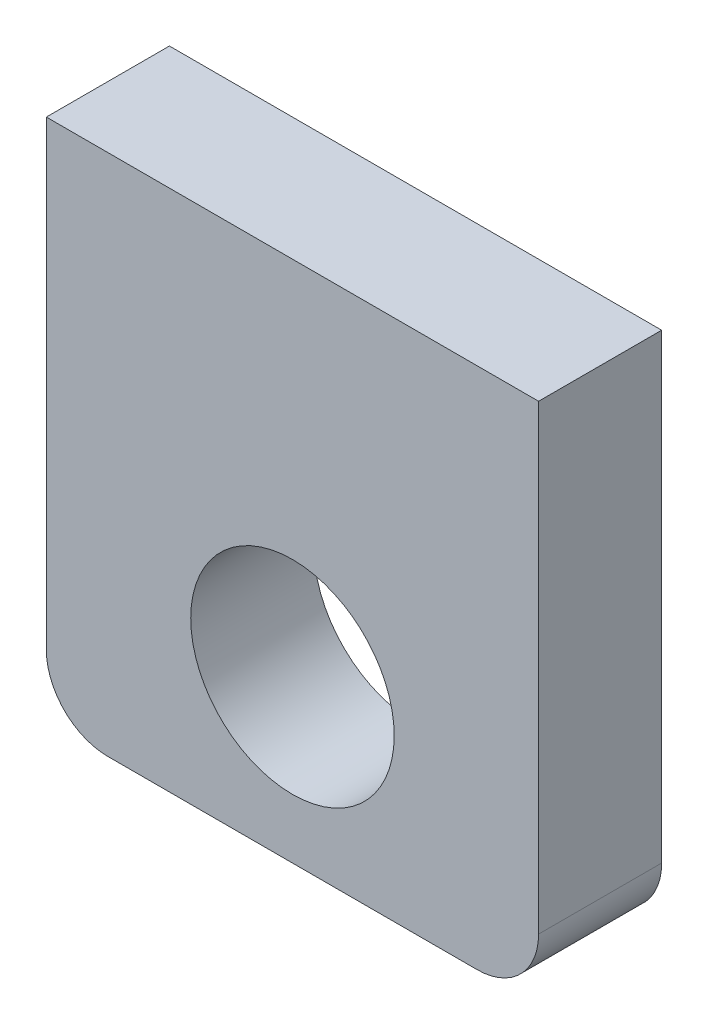
ISO-10303-21;
HEADER;
FILE_DESCRIPTION(('STEP AP214'),'2;1');
FILE_NAME('part.step','',(''),(''),'','','');
FILE_SCHEMA(('AUTOMOTIVE_DESIGN { 1 0 10303 214 1 1 1 1 }'));
ENDSEC;
DATA;
#1=APPLICATION_CONTEXT('core data for automotive mechanical design processes');
#2=APPLICATION_PROTOCOL_DEFINITION('international standard','automotive_design',2000,#1);
#3=PRODUCT_CONTEXT('',#1,'mechanical');
#4=PRODUCT('Part','Part','',(#3));
#5=PRODUCT_RELATED_PRODUCT_CATEGORY('part','',(#4));
#6=PRODUCT_DEFINITION_FORMATION('','',#4);
#7=PRODUCT_DEFINITION_CONTEXT('part definition',#1,'design');
#8=PRODUCT_DEFINITION('design','',#6,#7);
#9=PRODUCT_DEFINITION_SHAPE('','',#8);
#10=(LENGTH_UNIT() NAMED_UNIT(*) SI_UNIT(.MILLI.,.METRE.));
#11=(NAMED_UNIT(*) PLANE_ANGLE_UNIT() SI_UNIT($,.RADIAN.));
#12=(NAMED_UNIT(*) SI_UNIT($,.STERADIAN.) SOLID_ANGLE_UNIT());
#13=UNCERTAINTY_MEASURE_WITH_UNIT(LENGTH_MEASURE(1.E-05),#10,'distance_accuracy_value','');
#14=(GEOMETRIC_REPRESENTATION_CONTEXT(3) GLOBAL_UNCERTAINTY_ASSIGNED_CONTEXT((#13)) GLOBAL_UNIT_ASSIGNED_CONTEXT((#10,
#11,#12)) REPRESENTATION_CONTEXT('',''));
#15=CARTESIAN_POINT('',(0.,0.,0.));
#16=DIRECTION('',(0.,0.,1.));
#17=DIRECTION('',(1.,0.,0.));
#18=AXIS2_PLACEMENT_3D('',#15,#16,#17);
#19=CARTESIAN_POINT('',(25.4,-26.9875,6.35));
#20=DIRECTION('',(-1.,0.,0.));
#21=DIRECTION('',(0.,0.,1.));
#22=AXIS2_PLACEMENT_3D('',#19,#20,#21);
#23=PLANE('',#22);
#24=DIRECTION('',(0.,1.,0.));
#25=VECTOR('',#24,1.);
#26=CARTESIAN_POINT('',(25.4,-26.9875,6.35));
#27=LINE('',#26,#25);
#28=CARTESIAN_POINT('',(25.4,-20.6375,6.35));
#29=VERTEX_POINT('',#28);
#30=CARTESIAN_POINT('',(25.4,26.9875,6.35));
#31=VERTEX_POINT('',#30);
#32=EDGE_CURVE('E90',#29,#31,#27,.T.);
#33=ORIENTED_EDGE('',*,*,#32,.F.);
#34=DIRECTION('',(0.,0.,-1.));
#35=VECTOR('',#34,1.);
#36=CARTESIAN_POINT('',(25.4,-20.6375,6.35));
#37=LINE('',#36,#35);
#38=CARTESIAN_POINT('',(25.4,-20.6375,-6.35));
#39=VERTEX_POINT('',#38);
#40=EDGE_CURVE('E113',#29,#39,#37,.T.);
#41=ORIENTED_EDGE('',*,*,#40,.T.);
#42=DIRECTION('',(0.,1.,0.));
#43=VECTOR('',#42,1.);
#44=CARTESIAN_POINT('',(25.4,-26.9875,-6.35));
#45=LINE('',#44,#43);
#46=CARTESIAN_POINT('',(25.4,26.9875,-6.35));
#47=VERTEX_POINT('',#46);
#48=EDGE_CURVE('E111',#39,#47,#45,.T.);
#49=ORIENTED_EDGE('',*,*,#48,.T.);
#50=DIRECTION('',(0.,0.,-1.));
#51=VECTOR('',#50,1.);
#52=CARTESIAN_POINT('',(25.4,26.9875,6.35));
#53=LINE('',#52,#51);
#54=EDGE_CURVE('E105',#31,#47,#53,.T.);
#55=ORIENTED_EDGE('',*,*,#54,.F.);
#56=EDGE_LOOP('',(#33,#41,#49,#55));
#57=FACE_BOUND('',#56,.T.);
#58=ADVANCED_FACE('F36',(#57),#23,.F.);
#59=CARTESIAN_POINT('',(-25.4,26.9875,6.35));
#60=DIRECTION('',(0.,-1.,0.));
#61=DIRECTION('',(0.,0.,-1.));
#62=AXIS2_PLACEMENT_3D('',#59,#60,#61);
#63=PLANE('',#62);
#64=DIRECTION('',(-1.,0.,0.));
#65=VECTOR('',#64,1.);
#66=CARTESIAN_POINT('',(-25.4,26.9875,-6.35));
#67=LINE('',#66,#65);
#68=CARTESIAN_POINT('',(-25.4,26.9875,-6.35));
#69=VERTEX_POINT('',#68);
#70=EDGE_CURVE('E140',#47,#69,#67,.T.);
#71=ORIENTED_EDGE('',*,*,#70,.T.);
#72=DIRECTION('',(0.,0.,-1.));
#73=VECTOR('',#72,1.);
#74=CARTESIAN_POINT('',(-25.4,26.9875,6.35));
#75=LINE('',#74,#73);
#76=CARTESIAN_POINT('',(-25.4,26.9875,6.35));
#77=VERTEX_POINT('',#76);
#78=EDGE_CURVE('E107',#77,#69,#75,.T.);
#79=ORIENTED_EDGE('',*,*,#78,.F.);
#80=DIRECTION('',(-1.,0.,0.));
#81=VECTOR('',#80,1.);
#82=CARTESIAN_POINT('',(-25.4,26.9875,6.35));
#83=LINE('',#82,#81);
#84=EDGE_CURVE('E93',#31,#77,#83,.T.);
#85=ORIENTED_EDGE('',*,*,#84,.F.);
#86=ORIENTED_EDGE('',*,*,#54,.T.);
#87=EDGE_LOOP('',(#71,#79,#85,#86));
#88=FACE_BOUND('',#87,.T.);
#89=ADVANCED_FACE('F104',(#88),#63,.F.);
#90=CARTESIAN_POINT('',(-25.4,-26.9875,6.35));
#91=DIRECTION('',(1.,0.,0.));
#92=DIRECTION('',(0.,0.,-1.));
#93=AXIS2_PLACEMENT_3D('',#90,#91,#92);
#94=PLANE('',#93);
#95=DIRECTION('',(0.,-1.,0.));
#96=VECTOR('',#95,1.);
#97=CARTESIAN_POINT('',(-25.4,-26.9875,-6.35));
#98=LINE('',#97,#96);
#99=CARTESIAN_POINT('',(-25.4,-20.6375,-6.35));
#100=VERTEX_POINT('',#99);
#101=EDGE_CURVE('E138',#69,#100,#98,.T.);
#102=ORIENTED_EDGE('',*,*,#101,.T.);
#103=DIRECTION('',(0.,0.,-1.));
#104=VECTOR('',#103,1.);
#105=CARTESIAN_POINT('',(-25.4,-20.6375,6.35));
#106=LINE('',#105,#104);
#107=CARTESIAN_POINT('',(-25.4,-20.6375,6.35));
#108=VERTEX_POINT('',#107);
#109=EDGE_CURVE('E11',#100,#108,#106,.F.);
#110=ORIENTED_EDGE('',*,*,#109,.T.);
#111=DIRECTION('',(0.,-1.,0.));
#112=VECTOR('',#111,1.);
#113=CARTESIAN_POINT('',(-25.4,-26.9875,6.35));
#114=LINE('',#113,#112);
#115=EDGE_CURVE('E108',#77,#108,#114,.T.);
#116=ORIENTED_EDGE('',*,*,#115,.F.);
#117=ORIENTED_EDGE('',*,*,#78,.T.);
#118=EDGE_LOOP('',(#102,#110,#116,#117));
#119=FACE_BOUND('',#118,.T.);
#120=ADVANCED_FACE('F139',(#119),#94,.F.);
#121=CARTESIAN_POINT('',(-25.4,-26.9875,6.35));
#122=DIRECTION('',(0.,1.,0.));
#123=DIRECTION('',(0.,0.,1.));
#124=AXIS2_PLACEMENT_3D('',#121,#122,#123);
#125=PLANE('',#124);
#126=DIRECTION('',(1.,0.,0.));
#127=VECTOR('',#126,1.);
#128=CARTESIAN_POINT('',(-25.4,-26.9875,-6.35));
#129=LINE('',#128,#127);
#130=CARTESIAN_POINT('',(-19.05,-26.9875,-6.35));
#131=VERTEX_POINT('',#130);
#132=CARTESIAN_POINT('',(19.05,-26.9875,-6.35));
#133=VERTEX_POINT('',#132);
#134=EDGE_CURVE('E100',#131,#133,#129,.T.);
#135=ORIENTED_EDGE('',*,*,#134,.T.);
#136=DIRECTION('',(0.,0.,-1.));
#137=VECTOR('',#136,1.);
#138=CARTESIAN_POINT('',(19.05,-26.9875,6.35));
#139=LINE('',#138,#137);
#140=CARTESIAN_POINT('',(19.05,-26.9875,6.35));
#141=VERTEX_POINT('',#140);
#142=EDGE_CURVE('E57',#133,#141,#139,.F.);
#143=ORIENTED_EDGE('',*,*,#142,.T.);
#144=DIRECTION('',(1.,0.,0.));
#145=VECTOR('',#144,1.);
#146=CARTESIAN_POINT('',(-25.4,-26.9875,6.35));
#147=LINE('',#146,#145);
#148=CARTESIAN_POINT('',(-19.05,-26.9875,6.35));
#149=VERTEX_POINT('',#148);
#150=EDGE_CURVE('E117',#149,#141,#147,.T.);
#151=ORIENTED_EDGE('',*,*,#150,.F.);
#152=DIRECTION('',(0.,0.,-1.));
#153=VECTOR('',#152,1.);
#154=CARTESIAN_POINT('',(-19.05,-26.9875,6.35));
#155=LINE('',#154,#153);
#156=EDGE_CURVE('E124',#149,#131,#155,.T.);
#157=ORIENTED_EDGE('',*,*,#156,.T.);
#158=EDGE_LOOP('',(#135,#143,#151,#157));
#159=FACE_BOUND('',#158,.T.);
#160=ADVANCED_FACE('F132',(#159),#125,.F.);
#161=CARTESIAN_POINT('',(0.,0.,6.35));
#162=DIRECTION('',(0.,0.,-1.));
#163=DIRECTION('',(-1.,0.,0.));
#164=AXIS2_PLACEMENT_3D('',#161,#162,#163);
#165=PLANE('',#164);
#166=CARTESIAN_POINT('',(0.,-10.3505,6.35));
#167=DIRECTION('',(0.,0.,-1.));
#168=DIRECTION('',(-1.,0.,0.));
#169=AXIS2_PLACEMENT_3D('',#166,#167,#168);
#170=CIRCLE('',#169,10.499999971);
#171=CARTESIAN_POINT('',(-10.499999971,-10.3505,6.35));
#172=VERTEX_POINT('',#171);
#173=EDGE_CURVE('E144',#172,#172,#170,.T.);
#174=ORIENTED_EDGE('',*,*,#173,.T.);
#175=EDGE_LOOP('',(#174));
#176=FACE_BOUND('',#175,.T.);
#177=ORIENTED_EDGE('',*,*,#150,.T.);
#178=CARTESIAN_POINT('',(19.05,-20.6375,6.35));
#179=DIRECTION('',(0.,0.,-1.));
#180=DIRECTION('',(-1.,0.,0.));
#181=AXIS2_PLACEMENT_3D('',#178,#179,#180);
#182=CIRCLE('',#181,6.35);
#183=EDGE_CURVE('E44',#141,#29,#182,.F.);
#184=ORIENTED_EDGE('',*,*,#183,.T.);
#185=ORIENTED_EDGE('',*,*,#32,.T.);
#186=ORIENTED_EDGE('',*,*,#84,.T.);
#187=ORIENTED_EDGE('',*,*,#115,.T.);
#188=CARTESIAN_POINT('',(-19.05,-20.6375,6.35));
#189=DIRECTION('',(0.,0.,-1.));
#190=DIRECTION('',(-1.,0.,0.));
#191=AXIS2_PLACEMENT_3D('',#188,#189,#190);
#192=CIRCLE('',#191,6.35);
#193=EDGE_CURVE('E128',#108,#149,#192,.F.);
#194=ORIENTED_EDGE('',*,*,#193,.T.);
#195=EDGE_LOOP('',(#177,#184,#185,#186,#187,#194));
#196=FACE_BOUND('',#195,.T.);
#197=ADVANCED_FACE('F92',(#176,#196),#165,.F.);
#198=CARTESIAN_POINT('',(0.,0.,-6.35));
#199=DIRECTION('',(0.,0.,-1.));
#200=DIRECTION('',(-1.,0.,0.));
#201=AXIS2_PLACEMENT_3D('',#198,#199,#200);
#202=PLANE('',#201);
#203=CARTESIAN_POINT('',(0.,-10.3505,-6.35));
#204=DIRECTION('',(0.,0.,1.));
#205=DIRECTION('',(1.,0.,0.));
#206=AXIS2_PLACEMENT_3D('',#203,#204,#205);
#207=CIRCLE('',#206,10.499999971);
#208=CARTESIAN_POINT('',(10.499999971,-10.3505,-6.35));
#209=VERTEX_POINT('',#208);
#210=EDGE_CURVE('E149',#209,#209,#207,.T.);
#211=ORIENTED_EDGE('',*,*,#210,.T.);
#212=EDGE_LOOP('',(#211));
#213=FACE_BOUND('',#212,.T.);
#214=ORIENTED_EDGE('',*,*,#48,.F.);
#215=CARTESIAN_POINT('',(19.05,-20.6375,-6.35));
#216=DIRECTION('',(0.,0.,-1.));
#217=DIRECTION('',(-1.,0.,0.));
#218=AXIS2_PLACEMENT_3D('',#215,#216,#217);
#219=CIRCLE('',#218,6.35);
#220=EDGE_CURVE('E122',#39,#133,#219,.T.);
#221=ORIENTED_EDGE('',*,*,#220,.T.);
#222=ORIENTED_EDGE('',*,*,#134,.F.);
#223=CARTESIAN_POINT('',(-19.05,-20.6375,-6.35));
#224=DIRECTION('',(0.,0.,-1.));
#225=DIRECTION('',(-1.,0.,0.));
#226=AXIS2_PLACEMENT_3D('',#223,#224,#225);
#227=CIRCLE('',#226,6.35);
#228=EDGE_CURVE('E115',#131,#100,#227,.T.);
#229=ORIENTED_EDGE('',*,*,#228,.T.);
#230=ORIENTED_EDGE('',*,*,#101,.F.);
#231=ORIENTED_EDGE('',*,*,#70,.F.);
#232=EDGE_LOOP('',(#214,#221,#222,#229,#230,#231));
#233=FACE_BOUND('',#232,.T.);
#234=ADVANCED_FACE('F137',(#213,#233),#202,.T.);
#235=CARTESIAN_POINT('',(0.,-10.3505,-6.35));
#236=DIRECTION('',(0.,0.,1.));
#237=DIRECTION('',(1.,0.,0.));
#238=AXIS2_PLACEMENT_3D('',#235,#236,#237);
#239=CYLINDRICAL_SURFACE('',#238,10.499999971);
#240=ORIENTED_EDGE('',*,*,#210,.F.);
#241=EDGE_LOOP('',(#240));
#242=FACE_BOUND('',#241,.T.);
#243=ORIENTED_EDGE('',*,*,#173,.F.);
#244=EDGE_LOOP('',(#243));
#245=FACE_BOUND('',#244,.T.);
#246=ADVANCED_FACE('F154',(#242,#245),#239,.F.);
#247=CARTESIAN_POINT('',(19.05,-20.6375,6.35));
#248=DIRECTION('',(0.,0.,-1.));
#249=DIRECTION('',(-1.,0.,0.));
#250=AXIS2_PLACEMENT_3D('',#247,#248,#249);
#251=CYLINDRICAL_SURFACE('',#250,6.35);
#252=ORIENTED_EDGE('',*,*,#183,.F.);
#253=ORIENTED_EDGE('',*,*,#142,.F.);
#254=ORIENTED_EDGE('',*,*,#220,.F.);
#255=ORIENTED_EDGE('',*,*,#40,.F.);
#256=EDGE_LOOP('',(#252,#253,#254,#255));
#257=FACE_BOUND('',#256,.T.);
#258=ADVANCED_FACE('F157',(#257),#251,.T.);
#259=CARTESIAN_POINT('',(-19.05,-20.6375,6.35));
#260=DIRECTION('',(0.,0.,-1.));
#261=DIRECTION('',(-1.,0.,0.));
#262=AXIS2_PLACEMENT_3D('',#259,#260,#261);
#263=CYLINDRICAL_SURFACE('',#262,6.35);
#264=ORIENTED_EDGE('',*,*,#193,.F.);
#265=ORIENTED_EDGE('',*,*,#109,.F.);
#266=ORIENTED_EDGE('',*,*,#228,.F.);
#267=ORIENTED_EDGE('',*,*,#156,.F.);
#268=EDGE_LOOP('',(#264,#265,#266,#267));
#269=FACE_BOUND('',#268,.T.);
#270=ADVANCED_FACE('F38',(#269),#263,.T.);
#271=CLOSED_SHELL('',(#58,#89,#120,#160,#197,#234,#246,#258,#270));
#272=MANIFOLD_SOLID_BREP('B2',#271);
#273=ADVANCED_BREP_SHAPE_REPRESENTATION('',(#18,#272),#14);
#274=SHAPE_DEFINITION_REPRESENTATION(#9,#273);
ENDSEC;
END-ISO-10303-21;
